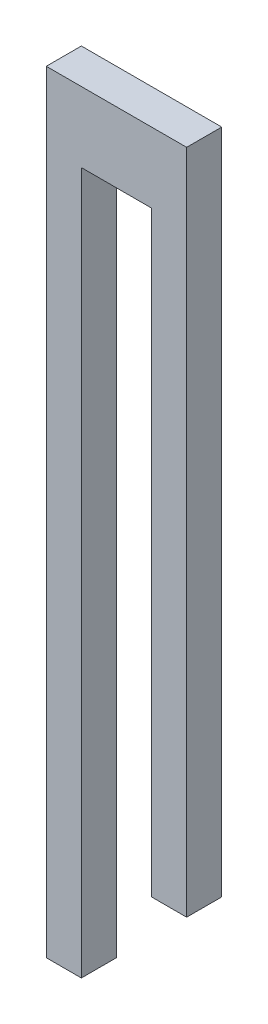
ISO-10303-21;
HEADER;
FILE_DESCRIPTION(('STEP AP214'),'2;1');
FILE_NAME('part.step','',(''),(''),'','','');
FILE_SCHEMA(('AUTOMOTIVE_DESIGN { 1 0 10303 214 1 1 1 1 }'));
ENDSEC;
DATA;
#1=APPLICATION_CONTEXT('core data for automotive mechanical design processes');
#2=APPLICATION_PROTOCOL_DEFINITION('international standard','automotive_design',2000,#1);
#3=PRODUCT_CONTEXT('',#1,'mechanical');
#4=PRODUCT('Part','Part','',(#3));
#5=PRODUCT_RELATED_PRODUCT_CATEGORY('part','',(#4));
#6=PRODUCT_DEFINITION_FORMATION('','',#4);
#7=PRODUCT_DEFINITION_CONTEXT('part definition',#1,'design');
#8=PRODUCT_DEFINITION('design','',#6,#7);
#9=PRODUCT_DEFINITION_SHAPE('','',#8);
#10=(LENGTH_UNIT() NAMED_UNIT(*) SI_UNIT(.MILLI.,.METRE.));
#11=(NAMED_UNIT(*) PLANE_ANGLE_UNIT() SI_UNIT($,.RADIAN.));
#12=(NAMED_UNIT(*) SI_UNIT($,.STERADIAN.) SOLID_ANGLE_UNIT());
#13=UNCERTAINTY_MEASURE_WITH_UNIT(LENGTH_MEASURE(1.E-05),#10,'distance_accuracy_value','');
#14=(GEOMETRIC_REPRESENTATION_CONTEXT(3) GLOBAL_UNCERTAINTY_ASSIGNED_CONTEXT((#13)) GLOBAL_UNIT_ASSIGNED_CONTEXT((#10,
#11,#12)) REPRESENTATION_CONTEXT('',''));
#15=CARTESIAN_POINT('',(0.,0.,0.));
#16=DIRECTION('',(0.,0.,1.));
#17=DIRECTION('',(1.,0.,0.));
#18=AXIS2_PLACEMENT_3D('',#15,#16,#17);
#19=CARTESIAN_POINT('',(0.,0.,0.));
#20=DIRECTION('',(0.,1.,0.));
#21=DIRECTION('',(0.,0.,1.));
#22=AXIS2_PLACEMENT_3D('',#19,#20,#21);
#23=PLANE('',#22);
#24=DIRECTION('',(0.,0.,-1.));
#25=VECTOR('',#24,1.);
#26=CARTESIAN_POINT('',(5.,0.,2.5));
#27=LINE('',#26,#25);
#28=CARTESIAN_POINT('',(5.,0.,2.5));
#29=VERTEX_POINT('',#28);
#30=CARTESIAN_POINT('',(5.,0.,-2.5));
#31=VERTEX_POINT('',#30);
#32=EDGE_CURVE('E119',#29,#31,#27,.T.);
#33=ORIENTED_EDGE('',*,*,#32,.F.);
#34=DIRECTION('',(1.,0.,0.));
#35=VECTOR('',#34,1.);
#36=CARTESIAN_POINT('',(10.,0.,2.5));
#37=LINE('',#36,#35);
#38=CARTESIAN_POINT('',(-5.,0.,2.5));
#39=VERTEX_POINT('',#38);
#40=EDGE_CURVE('E145',#39,#29,#37,.T.);
#41=ORIENTED_EDGE('',*,*,#40,.F.);
#42=DIRECTION('',(0.,0.,-1.));
#43=VECTOR('',#42,1.);
#44=CARTESIAN_POINT('',(-5.,0.,2.5));
#45=LINE('',#44,#43);
#46=CARTESIAN_POINT('',(-5.,0.,-2.5));
#47=VERTEX_POINT('',#46);
#48=EDGE_CURVE('E127',#39,#47,#45,.T.);
#49=ORIENTED_EDGE('',*,*,#48,.T.);
#50=DIRECTION('',(-1.,0.,0.));
#51=VECTOR('',#50,1.);
#52=CARTESIAN_POINT('',(10.,0.,-2.5));
#53=LINE('',#52,#51);
#54=EDGE_CURVE('E53',#31,#47,#53,.T.);
#55=ORIENTED_EDGE('',*,*,#54,.F.);
#56=EDGE_LOOP('',(#33,#41,#49,#55));
#57=FACE_BOUND('',#56,.T.);
#58=ADVANCED_FACE('F33',(#57),#23,.F.);
#59=CARTESIAN_POINT('',(-10.,10.,2.5));
#60=DIRECTION('',(1.,0.,0.));
#61=DIRECTION('',(0.,0.,-1.));
#62=AXIS2_PLACEMENT_3D('',#59,#60,#61);
#63=PLANE('',#62);
#64=DIRECTION('',(0.,-1.,0.));
#65=VECTOR('',#64,1.);
#66=CARTESIAN_POINT('',(-10.,10.,-2.5));
#67=LINE('',#66,#65);
#68=CARTESIAN_POINT('',(-10.,10.,-2.5));
#69=VERTEX_POINT('',#68);
#70=CARTESIAN_POINT('',(-10.,-100.,-2.5));
#71=VERTEX_POINT('',#70);
#72=EDGE_CURVE('E154',#69,#71,#67,.T.);
#73=ORIENTED_EDGE('',*,*,#72,.T.);
#74=DIRECTION('',(0.,0.,-1.));
#75=VECTOR('',#74,1.);
#76=CARTESIAN_POINT('',(-10.,-100.,2.5));
#77=LINE('',#76,#75);
#78=CARTESIAN_POINT('',(-10.,-100.,2.5));
#79=VERTEX_POINT('',#78);
#80=EDGE_CURVE('E128',#79,#71,#77,.T.);
#81=ORIENTED_EDGE('',*,*,#80,.F.);
#82=DIRECTION('',(0.,-1.,0.));
#83=VECTOR('',#82,1.);
#84=CARTESIAN_POINT('',(-10.,10.,2.5));
#85=LINE('',#84,#83);
#86=CARTESIAN_POINT('',(-10.,10.,2.5));
#87=VERTEX_POINT('',#86);
#88=EDGE_CURVE('E11',#87,#79,#85,.T.);
#89=ORIENTED_EDGE('',*,*,#88,.F.);
#90=DIRECTION('',(0.,0.,1.));
#91=VECTOR('',#90,1.);
#92=CARTESIAN_POINT('',(-10.,10.,2.5));
#93=LINE('',#92,#91);
#94=EDGE_CURVE('E146',#69,#87,#93,.T.);
#95=ORIENTED_EDGE('',*,*,#94,.F.);
#96=EDGE_LOOP('',(#73,#81,#89,#95));
#97=FACE_BOUND('',#96,.T.);
#98=ADVANCED_FACE('F35',(#97),#63,.F.);
#99=CARTESIAN_POINT('',(10.,10.,2.5));
#100=DIRECTION('',(0.,0.,-1.));
#101=DIRECTION('',(-1.,0.,0.));
#102=AXIS2_PLACEMENT_3D('',#99,#100,#101);
#103=PLANE('',#102);
#104=ORIENTED_EDGE('',*,*,#88,.T.);
#105=DIRECTION('',(1.,0.,0.));
#106=VECTOR('',#105,1.);
#107=CARTESIAN_POINT('',(-10.,-100.,2.5));
#108=LINE('',#107,#106);
#109=CARTESIAN_POINT('',(-5.,-100.,2.5));
#110=VERTEX_POINT('',#109);
#111=EDGE_CURVE('E136',#79,#110,#108,.T.);
#112=ORIENTED_EDGE('',*,*,#111,.T.);
#113=DIRECTION('',(0.,1.,0.));
#114=VECTOR('',#113,1.);
#115=CARTESIAN_POINT('',(-5.,-100.,2.5));
#116=LINE('',#115,#114);
#117=EDGE_CURVE('E139',#110,#39,#116,.T.);
#118=ORIENTED_EDGE('',*,*,#117,.T.);
#119=ORIENTED_EDGE('',*,*,#40,.T.);
#120=DIRECTION('',(0.,1.,0.));
#121=VECTOR('',#120,1.);
#122=CARTESIAN_POINT('',(5.,-85.,2.5));
#123=LINE('',#122,#121);
#124=CARTESIAN_POINT('',(5.,-85.,2.5));
#125=VERTEX_POINT('',#124);
#126=EDGE_CURVE('E111',#125,#29,#123,.T.);
#127=ORIENTED_EDGE('',*,*,#126,.F.);
#128=DIRECTION('',(-1.,0.,0.));
#129=VECTOR('',#128,1.);
#130=CARTESIAN_POINT('',(10.,-85.,2.5));
#131=LINE('',#130,#129);
#132=CARTESIAN_POINT('',(10.,-85.,2.5));
#133=VERTEX_POINT('',#132);
#134=EDGE_CURVE('E108',#133,#125,#131,.T.);
#135=ORIENTED_EDGE('',*,*,#134,.F.);
#136=DIRECTION('',(0.,-1.,0.));
#137=VECTOR('',#136,1.);
#138=CARTESIAN_POINT('',(10.,10.,2.5));
#139=LINE('',#138,#137);
#140=CARTESIAN_POINT('',(10.,10.,2.5));
#141=VERTEX_POINT('',#140);
#142=EDGE_CURVE('E41',#141,#133,#139,.T.);
#143=ORIENTED_EDGE('',*,*,#142,.F.);
#144=DIRECTION('',(1.,0.,0.));
#145=VECTOR('',#144,1.);
#146=CARTESIAN_POINT('',(10.,10.,2.5));
#147=LINE('',#146,#145);
#148=EDGE_CURVE('E149',#87,#141,#147,.T.);
#149=ORIENTED_EDGE('',*,*,#148,.F.);
#150=EDGE_LOOP('',(#104,#112,#118,#119,#127,#135,#143,#149));
#151=FACE_BOUND('',#150,.T.);
#152=ADVANCED_FACE('F109',(#151),#103,.F.);
#153=CARTESIAN_POINT('',(10.,10.,2.5));
#154=DIRECTION('',(-1.,0.,0.));
#155=DIRECTION('',(0.,0.,1.));
#156=AXIS2_PLACEMENT_3D('',#153,#154,#155);
#157=PLANE('',#156);
#158=ORIENTED_EDGE('',*,*,#142,.T.);
#159=DIRECTION('',(0.,0.,1.));
#160=VECTOR('',#159,1.);
#161=CARTESIAN_POINT('',(10.,-85.,2.5));
#162=LINE('',#161,#160);
#163=CARTESIAN_POINT('',(10.,-85.,-2.5));
#164=VERTEX_POINT('',#163);
#165=EDGE_CURVE('E103',#164,#133,#162,.T.);
#166=ORIENTED_EDGE('',*,*,#165,.F.);
#167=DIRECTION('',(0.,-1.,0.));
#168=VECTOR('',#167,1.);
#169=CARTESIAN_POINT('',(10.,10.,-2.5));
#170=LINE('',#169,#168);
#171=CARTESIAN_POINT('',(10.,10.,-2.5));
#172=VERTEX_POINT('',#171);
#173=EDGE_CURVE('E106',#172,#164,#170,.T.);
#174=ORIENTED_EDGE('',*,*,#173,.F.);
#175=DIRECTION('',(0.,0.,-1.));
#176=VECTOR('',#175,1.);
#177=CARTESIAN_POINT('',(10.,10.,2.5));
#178=LINE('',#177,#176);
#179=EDGE_CURVE('E104',#141,#172,#178,.T.);
#180=ORIENTED_EDGE('',*,*,#179,.F.);
#181=EDGE_LOOP('',(#158,#166,#174,#180));
#182=FACE_BOUND('',#181,.T.);
#183=ADVANCED_FACE('F100',(#182),#157,.F.);
#184=CARTESIAN_POINT('',(10.,10.,-2.5));
#185=DIRECTION('',(0.,0.,1.));
#186=DIRECTION('',(1.,0.,0.));
#187=AXIS2_PLACEMENT_3D('',#184,#185,#186);
#188=PLANE('',#187);
#189=ORIENTED_EDGE('',*,*,#173,.T.);
#190=DIRECTION('',(1.,0.,0.));
#191=VECTOR('',#190,1.);
#192=CARTESIAN_POINT('',(10.,-85.,-2.5));
#193=LINE('',#192,#191);
#194=CARTESIAN_POINT('',(5.,-85.,-2.5));
#195=VERTEX_POINT('',#194);
#196=EDGE_CURVE('E118',#195,#164,#193,.T.);
#197=ORIENTED_EDGE('',*,*,#196,.F.);
#198=DIRECTION('',(0.,1.,0.));
#199=VECTOR('',#198,1.);
#200=CARTESIAN_POINT('',(5.,-85.,-2.5));
#201=LINE('',#200,#199);
#202=EDGE_CURVE('E48',#195,#31,#201,.T.);
#203=ORIENTED_EDGE('',*,*,#202,.T.);
#204=ORIENTED_EDGE('',*,*,#54,.T.);
#205=DIRECTION('',(0.,1.,0.));
#206=VECTOR('',#205,1.);
#207=CARTESIAN_POINT('',(-5.,-100.,-2.5));
#208=LINE('',#207,#206);
#209=CARTESIAN_POINT('',(-5.,-100.,-2.5));
#210=VERTEX_POINT('',#209);
#211=EDGE_CURVE('E143',#210,#47,#208,.T.);
#212=ORIENTED_EDGE('',*,*,#211,.F.);
#213=DIRECTION('',(1.,0.,0.));
#214=VECTOR('',#213,1.);
#215=CARTESIAN_POINT('',(-10.,-100.,-2.5));
#216=LINE('',#215,#214);
#217=EDGE_CURVE('E131',#71,#210,#216,.T.);
#218=ORIENTED_EDGE('',*,*,#217,.F.);
#219=ORIENTED_EDGE('',*,*,#72,.F.);
#220=DIRECTION('',(-1.,0.,0.));
#221=VECTOR('',#220,1.);
#222=CARTESIAN_POINT('',(10.,10.,-2.5));
#223=LINE('',#222,#221);
#224=EDGE_CURVE('E152',#172,#69,#223,.T.);
#225=ORIENTED_EDGE('',*,*,#224,.F.);
#226=EDGE_LOOP('',(#189,#197,#203,#204,#212,#218,#219,#225));
#227=FACE_BOUND('',#226,.T.);
#228=ADVANCED_FACE('F159',(#227),#188,.F.);
#229=CARTESIAN_POINT('',(0.,10.,0.));
#230=DIRECTION('',(0.,1.,0.));
#231=DIRECTION('',(0.,0.,1.));
#232=AXIS2_PLACEMENT_3D('',#229,#230,#231);
#233=PLANE('',#232);
#234=ORIENTED_EDGE('',*,*,#94,.T.);
#235=ORIENTED_EDGE('',*,*,#148,.T.);
#236=ORIENTED_EDGE('',*,*,#179,.T.);
#237=ORIENTED_EDGE('',*,*,#224,.T.);
#238=EDGE_LOOP('',(#234,#235,#236,#237));
#239=FACE_BOUND('',#238,.T.);
#240=ADVANCED_FACE('F164',(#239),#233,.T.);
#241=CARTESIAN_POINT('',(-5.,-100.,2.5));
#242=DIRECTION('',(1.,0.,0.));
#243=DIRECTION('',(0.,0.,-1.));
#244=AXIS2_PLACEMENT_3D('',#241,#242,#243);
#245=PLANE('',#244);
#246=ORIENTED_EDGE('',*,*,#48,.F.);
#247=ORIENTED_EDGE('',*,*,#117,.F.);
#248=DIRECTION('',(0.,0.,-1.));
#249=VECTOR('',#248,1.);
#250=CARTESIAN_POINT('',(-5.,-100.,2.5));
#251=LINE('',#250,#249);
#252=EDGE_CURVE('E133',#110,#210,#251,.T.);
#253=ORIENTED_EDGE('',*,*,#252,.T.);
#254=ORIENTED_EDGE('',*,*,#211,.T.);
#255=EDGE_LOOP('',(#246,#247,#253,#254));
#256=FACE_BOUND('',#255,.T.);
#257=ADVANCED_FACE('F174',(#256),#245,.T.);
#258=CARTESIAN_POINT('',(0.,-100.,0.));
#259=DIRECTION('',(0.,-1.,0.));
#260=DIRECTION('',(0.,0.,-1.));
#261=AXIS2_PLACEMENT_3D('',#258,#259,#260);
#262=PLANE('',#261);
#263=ORIENTED_EDGE('',*,*,#80,.T.);
#264=ORIENTED_EDGE('',*,*,#217,.T.);
#265=ORIENTED_EDGE('',*,*,#252,.F.);
#266=ORIENTED_EDGE('',*,*,#111,.F.);
#267=EDGE_LOOP('',(#263,#264,#265,#266));
#268=FACE_BOUND('',#267,.T.);
#269=ADVANCED_FACE('F171',(#268),#262,.T.);
#270=CARTESIAN_POINT('',(5.,-85.,2.5));
#271=DIRECTION('',(1.,0.,0.));
#272=DIRECTION('',(0.,0.,-1.));
#273=AXIS2_PLACEMENT_3D('',#270,#271,#272);
#274=PLANE('',#273);
#275=ORIENTED_EDGE('',*,*,#32,.T.);
#276=ORIENTED_EDGE('',*,*,#202,.F.);
#277=DIRECTION('',(0.,0.,-1.));
#278=VECTOR('',#277,1.);
#279=CARTESIAN_POINT('',(5.,-85.,2.5));
#280=LINE('',#279,#278);
#281=EDGE_CURVE('E114',#125,#195,#280,.T.);
#282=ORIENTED_EDGE('',*,*,#281,.F.);
#283=ORIENTED_EDGE('',*,*,#126,.T.);
#284=EDGE_LOOP('',(#275,#276,#282,#283));
#285=FACE_BOUND('',#284,.T.);
#286=ADVANCED_FACE('F179',(#285),#274,.F.);
#287=CARTESIAN_POINT('',(0.,-85.,0.));
#288=DIRECTION('',(0.,1.,0.));
#289=DIRECTION('',(0.,0.,1.));
#290=AXIS2_PLACEMENT_3D('',#287,#288,#289);
#291=PLANE('',#290);
#292=ORIENTED_EDGE('',*,*,#165,.T.);
#293=ORIENTED_EDGE('',*,*,#134,.T.);
#294=ORIENTED_EDGE('',*,*,#281,.T.);
#295=ORIENTED_EDGE('',*,*,#196,.T.);
#296=EDGE_LOOP('',(#292,#293,#294,#295));
#297=FACE_BOUND('',#296,.T.);
#298=ADVANCED_FACE('F117',(#297),#291,.F.);
#299=CLOSED_SHELL('',(#58,#98,#152,#183,#228,#240,#257,#269,#286,#298));
#300=MANIFOLD_SOLID_BREP('B2',#299);
#301=ADVANCED_BREP_SHAPE_REPRESENTATION('',(#18,#300),#14);
#302=SHAPE_DEFINITION_REPRESENTATION(#9,#301);
ENDSEC;
END-ISO-10303-21;
